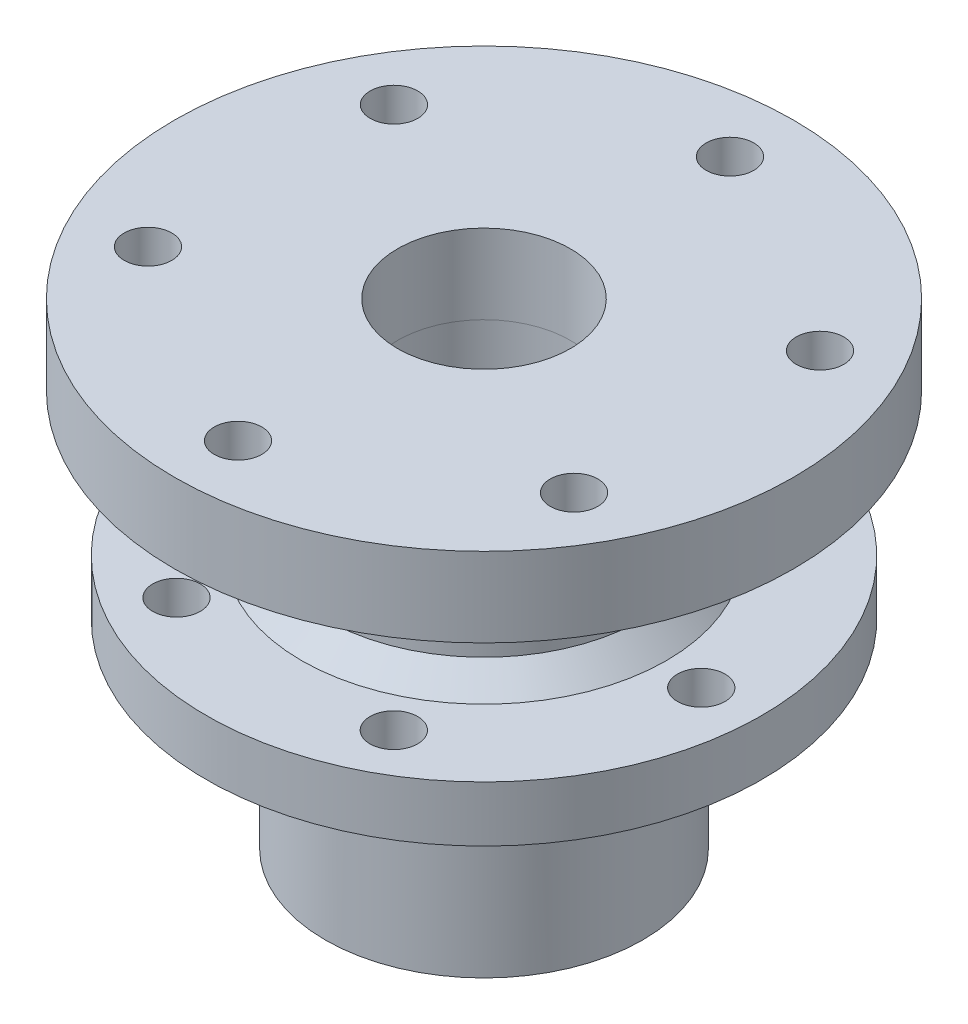
ISO-10303-21;
HEADER;
FILE_DESCRIPTION(('STEP AP214'),'2;1');
FILE_NAME('part.step','',(''),(''),'','','');
FILE_SCHEMA(('AUTOMOTIVE_DESIGN { 1 0 10303 214 1 1 1 1 }'));
ENDSEC;
DATA;
#1=APPLICATION_CONTEXT('core data for automotive mechanical design processes');
#2=APPLICATION_PROTOCOL_DEFINITION('international standard','automotive_design',2000,#1);
#3=PRODUCT_CONTEXT('',#1,'mechanical');
#4=PRODUCT('Part','Part','',(#3));
#5=PRODUCT_RELATED_PRODUCT_CATEGORY('part','',(#4));
#6=PRODUCT_DEFINITION_FORMATION('','',#4);
#7=PRODUCT_DEFINITION_CONTEXT('part definition',#1,'design');
#8=PRODUCT_DEFINITION('design','',#6,#7);
#9=PRODUCT_DEFINITION_SHAPE('','',#8);
#10=(LENGTH_UNIT() NAMED_UNIT(*) SI_UNIT(.MILLI.,.METRE.));
#11=(NAMED_UNIT(*) PLANE_ANGLE_UNIT() SI_UNIT($,.RADIAN.));
#12=(NAMED_UNIT(*) SI_UNIT($,.STERADIAN.) SOLID_ANGLE_UNIT());
#13=UNCERTAINTY_MEASURE_WITH_UNIT(LENGTH_MEASURE(1.E-05),#10,'distance_accuracy_value','');
#14=(GEOMETRIC_REPRESENTATION_CONTEXT(3) GLOBAL_UNCERTAINTY_ASSIGNED_CONTEXT((#13)) GLOBAL_UNIT_ASSIGNED_CONTEXT((#10,
#11,#12)) REPRESENTATION_CONTEXT('',''));
#15=CARTESIAN_POINT('',(0.,0.,0.));
#16=DIRECTION('',(0.,0.,1.));
#17=DIRECTION('',(1.,0.,0.));
#18=AXIS2_PLACEMENT_3D('',#15,#16,#17);
#19=CARTESIAN_POINT('',(0.,40.,0.));
#20=DIRECTION('',(0.,-1.,0.));
#21=DIRECTION('',(0.,0.,-1.));
#22=AXIS2_PLACEMENT_3D('',#19,#20,#21);
#23=CYLINDRICAL_SURFACE('',#22,20.);
#24=CARTESIAN_POINT('',(0.,25.,0.));
#25=DIRECTION('',(0.,-1.,0.));
#26=DIRECTION('',(0.,0.,-1.));
#27=AXIS2_PLACEMENT_3D('',#24,#25,#26);
#28=CIRCLE('',#27,20.);
#29=CARTESIAN_POINT('',(0.,25.,-20.));
#30=VERTEX_POINT('',#29);
#31=EDGE_CURVE('E10',#30,#30,#28,.F.);
#32=ORIENTED_EDGE('',*,*,#31,.T.);
#33=EDGE_LOOP('',(#32));
#34=FACE_BOUND('',#33,.T.);
#35=CARTESIAN_POINT('',(0.,36.,0.));
#36=DIRECTION('',(0.,1.,0.));
#37=DIRECTION('',(0.,0.,1.));
#38=AXIS2_PLACEMENT_3D('',#35,#36,#37);
#39=CIRCLE('',#38,20.);
#40=CARTESIAN_POINT('',(0.,36.,20.));
#41=VERTEX_POINT('',#40);
#42=EDGE_CURVE('E43',#41,#41,#39,.F.);
#43=ORIENTED_EDGE('',*,*,#42,.T.);
#44=EDGE_LOOP('',(#43));
#45=FACE_BOUND('',#44,.T.);
#46=ADVANCED_FACE('F30',(#34,#45),#23,.T.);
#47=CARTESIAN_POINT('',(0.,-10.,0.));
#48=DIRECTION('',(0.,1.,0.));
#49=DIRECTION('',(0.,0.,1.));
#50=AXIS2_PLACEMENT_3D('',#47,#48,#49);
#51=PLANE('',#50);
#52=CARTESIAN_POINT('',(0.,-10.,0.));
#53=DIRECTION('',(0.,1.,0.));
#54=DIRECTION('',(0.,0.,1.));
#55=AXIS2_PLACEMENT_3D('',#52,#53,#54);
#56=CIRCLE('',#55,20.);
#57=CARTESIAN_POINT('',(0.,-10.,20.));
#58=VERTEX_POINT('',#57);
#59=EDGE_CURVE('E109',#58,#58,#56,.T.);
#60=ORIENTED_EDGE('',*,*,#59,.F.);
#61=EDGE_LOOP('',(#60));
#62=FACE_BOUND('',#61,.T.);
#63=CARTESIAN_POINT('',(0.,-10.,0.));
#64=DIRECTION('',(0.,1.,0.));
#65=DIRECTION('',(0.,0.,1.));
#66=AXIS2_PLACEMENT_3D('',#63,#64,#65);
#67=CIRCLE('',#66,11.);
#68=CARTESIAN_POINT('',(0.,-10.,11.));
#69=VERTEX_POINT('',#68);
#70=EDGE_CURVE('E106',#69,#69,#67,.T.);
#71=ORIENTED_EDGE('',*,*,#70,.T.);
#72=EDGE_LOOP('',(#71));
#73=FACE_BOUND('',#72,.T.);
#74=ADVANCED_FACE('F140',(#62,#73),#51,.F.);
#75=CARTESIAN_POINT('',(0.,15.,0.));
#76=DIRECTION('',(0.,-1.,0.));
#77=DIRECTION('',(0.,0.,-1.));
#78=AXIS2_PLACEMENT_3D('',#75,#76,#77);
#79=CIRCLE('',#78,20.);
#80=CARTESIAN_POINT('',(0.,15.,-20.));
#81=VERTEX_POINT('',#80);
#82=EDGE_CURVE('E88',#81,#81,#79,.T.);
#83=ORIENTED_EDGE('',*,*,#82,.T.);
#84=EDGE_LOOP('',(#83));
#85=FACE_BOUND('',#84,.T.);
#86=ORIENTED_EDGE('',*,*,#59,.T.);
#87=EDGE_LOOP('',(#86));
#88=FACE_BOUND('',#87,.T.);
#89=ADVANCED_FACE('F119',(#85,#88),#23,.T.);
#90=CARTESIAN_POINT('',(0.,40.,0.));
#91=DIRECTION('',(0.,-1.,0.));
#92=DIRECTION('',(0.,0.,-1.));
#93=AXIS2_PLACEMENT_3D('',#90,#91,#92);
#94=CYLINDRICAL_SURFACE('',#93,11.);
#95=CARTESIAN_POINT('',(0.,40.,0.));
#96=DIRECTION('',(0.,1.,0.));
#97=DIRECTION('',(0.,0.,1.));
#98=AXIS2_PLACEMENT_3D('',#95,#96,#97);
#99=CIRCLE('',#98,11.);
#100=CARTESIAN_POINT('',(0.,40.,11.));
#101=VERTEX_POINT('',#100);
#102=EDGE_CURVE('E101',#101,#101,#99,.T.);
#103=ORIENTED_EDGE('',*,*,#102,.T.);
#104=EDGE_LOOP('',(#103));
#105=FACE_BOUND('',#104,.T.);
#106=ORIENTED_EDGE('',*,*,#70,.F.);
#107=EDGE_LOOP('',(#106));
#108=FACE_BOUND('',#107,.T.);
#109=ADVANCED_FACE('F149',(#105,#108),#94,.F.);
#110=CARTESIAN_POINT('',(0.,40.,0.));
#111=DIRECTION('',(0.,1.,0.));
#112=DIRECTION('',(0.,0.,1.));
#113=AXIS2_PLACEMENT_3D('',#110,#111,#112);
#114=PLANE('',#113);
#115=CARTESIAN_POINT('',(-26.8467875173174,40.,-15.4999999999996));
#116=DIRECTION('',(0.,1.,0.));
#117=DIRECTION('',(0.,0.,1.));
#118=AXIS2_PLACEMENT_3D('',#115,#116,#117);
#119=CIRCLE('',#118,3.00000000000099);
#120=CARTESIAN_POINT('',(-26.8467875173174,40.,-12.4999999999986));
#121=VERTEX_POINT('',#120);
#122=EDGE_CURVE('E352',#121,#121,#119,.F.);
#123=ORIENTED_EDGE('',*,*,#122,.F.);
#124=EDGE_LOOP('',(#123));
#125=FACE_BOUND('',#124,.T.);
#126=CARTESIAN_POINT('',(-26.846787517317,40.,15.5000000000004));
#127=DIRECTION('',(0.,1.,0.));
#128=DIRECTION('',(0.,0.,1.));
#129=AXIS2_PLACEMENT_3D('',#126,#127,#128);
#130=CIRCLE('',#129,3.00000000000099);
#131=CARTESIAN_POINT('',(-26.846787517317,40.,18.5000000000014));
#132=VERTEX_POINT('',#131);
#133=EDGE_CURVE('E356',#132,#132,#130,.F.);
#134=ORIENTED_EDGE('',*,*,#133,.F.);
#135=EDGE_LOOP('',(#134));
#136=FACE_BOUND('',#135,.T.);
#137=CARTESIAN_POINT('',(8.54895869423195E-13,40.,31.));
#138=DIRECTION('',(0.,1.,0.));
#139=DIRECTION('',(0.,0.,1.));
#140=AXIS2_PLACEMENT_3D('',#137,#138,#139);
#141=CIRCLE('',#140,3.00000000000101);
#142=CARTESIAN_POINT('',(8.54895869423195E-13,40.,34.000000000001));
#143=VERTEX_POINT('',#142);
#144=EDGE_CURVE('E363',#143,#143,#141,.F.);
#145=ORIENTED_EDGE('',*,*,#144,.F.);
#146=EDGE_LOOP('',(#145));
#147=FACE_BOUND('',#146,.T.);
#148=CARTESIAN_POINT('',(26.8467875173182,40.,15.4999999999996));
#149=DIRECTION('',(0.,1.,0.));
#150=DIRECTION('',(0.,0.,1.));
#151=AXIS2_PLACEMENT_3D('',#148,#149,#150);
#152=CIRCLE('',#151,3.00000000000099);
#153=CARTESIAN_POINT('',(26.8467875173182,40.,18.5000000000006));
#154=VERTEX_POINT('',#153);
#155=EDGE_CURVE('E369',#154,#154,#152,.F.);
#156=ORIENTED_EDGE('',*,*,#155,.F.);
#157=EDGE_LOOP('',(#156));
#158=FACE_BOUND('',#157,.T.);
#159=CARTESIAN_POINT('',(26.8467875173178,40.,-15.5000000000004));
#160=DIRECTION('',(0.,1.,0.));
#161=DIRECTION('',(0.,0.,1.));
#162=AXIS2_PLACEMENT_3D('',#159,#160,#161);
#163=CIRCLE('',#162,3.00000000000099);
#164=CARTESIAN_POINT('',(26.8467875173178,40.,-12.4999999999994));
#165=VERTEX_POINT('',#164);
#166=EDGE_CURVE('E375',#165,#165,#163,.F.);
#167=ORIENTED_EDGE('',*,*,#166,.F.);
#168=EDGE_LOOP('',(#167));
#169=FACE_BOUND('',#168,.T.);
#170=CARTESIAN_POINT('',(0.,40.,-31.));
#171=DIRECTION('',(0.,1.,0.));
#172=DIRECTION('',(0.,0.,1.));
#173=AXIS2_PLACEMENT_3D('',#170,#171,#172);
#174=CIRCLE('',#173,3.000000000001);
#175=CARTESIAN_POINT('',(0.,40.,-27.999999999999));
#176=VERTEX_POINT('',#175);
#177=EDGE_CURVE('E381',#176,#176,#174,.F.);
#178=ORIENTED_EDGE('',*,*,#177,.F.);
#179=EDGE_LOOP('',(#178));
#180=FACE_BOUND('',#179,.T.);
#181=CARTESIAN_POINT('',(0.,40.,0.));
#182=DIRECTION('',(0.,1.,0.));
#183=DIRECTION('',(0.,0.,1.));
#184=AXIS2_PLACEMENT_3D('',#181,#182,#183);
#185=CIRCLE('',#184,24.);
#186=CARTESIAN_POINT('',(0.,40.,24.));
#187=VERTEX_POINT('',#186);
#188=EDGE_CURVE('E112',#187,#187,#185,.T.);
#189=ORIENTED_EDGE('',*,*,#188,.T.);
#190=EDGE_LOOP('',(#189));
#191=FACE_BOUND('',#190,.T.);
#192=CARTESIAN_POINT('',(0.,40.,0.));
#193=DIRECTION('',(0.,1.,0.));
#194=DIRECTION('',(0.,0.,1.));
#195=AXIS2_PLACEMENT_3D('',#192,#193,#194);
#196=CIRCLE('',#195,39.);
#197=CARTESIAN_POINT('',(0.,40.,39.));
#198=VERTEX_POINT('',#197);
#199=EDGE_CURVE('E94',#198,#198,#196,.T.);
#200=ORIENTED_EDGE('',*,*,#199,.F.);
#201=EDGE_LOOP('',(#200));
#202=FACE_BOUND('',#201,.T.);
#203=ADVANCED_FACE('F153',(#125,#136,#147,#158,#169,#180,#191,#202),#114,.F.);
#204=CARTESIAN_POINT('',(0.,50.,0.));
#205=DIRECTION('',(0.,1.,0.));
#206=DIRECTION('',(0.,0.,1.));
#207=AXIS2_PLACEMENT_3D('',#204,#205,#206);
#208=PLANE('',#207);
#209=CARTESIAN_POINT('',(-26.8467875173174,50.,-15.4999999999996));
#210=DIRECTION('',(0.,1.,0.));
#211=DIRECTION('',(0.,0.,1.));
#212=AXIS2_PLACEMENT_3D('',#209,#210,#211);
#213=CIRCLE('',#212,3.00000000000099);
#214=CARTESIAN_POINT('',(-26.8467875173174,50.,-12.4999999999986));
#215=VERTEX_POINT('',#214);
#216=EDGE_CURVE('E349',#215,#215,#213,.T.);
#217=ORIENTED_EDGE('',*,*,#216,.F.);
#218=EDGE_LOOP('',(#217));
#219=FACE_BOUND('',#218,.T.);
#220=CARTESIAN_POINT('',(-26.846787517317,50.,15.5000000000004));
#221=DIRECTION('',(0.,1.,0.));
#222=DIRECTION('',(0.,0.,1.));
#223=AXIS2_PLACEMENT_3D('',#220,#221,#222);
#224=CIRCLE('',#223,3.00000000000099);
#225=CARTESIAN_POINT('',(-26.846787517317,50.,18.5000000000014));
#226=VERTEX_POINT('',#225);
#227=EDGE_CURVE('E353',#226,#226,#224,.T.);
#228=ORIENTED_EDGE('',*,*,#227,.F.);
#229=EDGE_LOOP('',(#228));
#230=FACE_BOUND('',#229,.T.);
#231=CARTESIAN_POINT('',(8.54895869423195E-13,50.,31.));
#232=DIRECTION('',(0.,1.,0.));
#233=DIRECTION('',(0.,0.,1.));
#234=AXIS2_PLACEMENT_3D('',#231,#232,#233);
#235=CIRCLE('',#234,3.00000000000101);
#236=CARTESIAN_POINT('',(8.54895869423195E-13,50.,34.000000000001));
#237=VERTEX_POINT('',#236);
#238=EDGE_CURVE('E361',#237,#237,#235,.T.);
#239=ORIENTED_EDGE('',*,*,#238,.F.);
#240=EDGE_LOOP('',(#239));
#241=FACE_BOUND('',#240,.T.);
#242=CARTESIAN_POINT('',(26.8467875173182,50.,15.4999999999996));
#243=DIRECTION('',(0.,1.,0.));
#244=DIRECTION('',(0.,0.,1.));
#245=AXIS2_PLACEMENT_3D('',#242,#243,#244);
#246=CIRCLE('',#245,3.00000000000099);
#247=CARTESIAN_POINT('',(26.8467875173182,50.,18.5000000000006));
#248=VERTEX_POINT('',#247);
#249=EDGE_CURVE('E366',#248,#248,#246,.T.);
#250=ORIENTED_EDGE('',*,*,#249,.F.);
#251=EDGE_LOOP('',(#250));
#252=FACE_BOUND('',#251,.T.);
#253=CARTESIAN_POINT('',(26.8467875173178,50.,-15.5000000000004));
#254=DIRECTION('',(0.,1.,0.));
#255=DIRECTION('',(0.,0.,1.));
#256=AXIS2_PLACEMENT_3D('',#253,#254,#255);
#257=CIRCLE('',#256,3.00000000000099);
#258=CARTESIAN_POINT('',(26.8467875173178,50.,-12.4999999999994));
#259=VERTEX_POINT('',#258);
#260=EDGE_CURVE('E372',#259,#259,#257,.T.);
#261=ORIENTED_EDGE('',*,*,#260,.F.);
#262=EDGE_LOOP('',(#261));
#263=FACE_BOUND('',#262,.T.);
#264=CARTESIAN_POINT('',(0.,50.,-31.));
#265=DIRECTION('',(0.,1.,0.));
#266=DIRECTION('',(0.,0.,1.));
#267=AXIS2_PLACEMENT_3D('',#264,#265,#266);
#268=CIRCLE('',#267,3.000000000001);
#269=CARTESIAN_POINT('',(0.,50.,-27.999999999999));
#270=VERTEX_POINT('',#269);
#271=EDGE_CURVE('E378',#270,#270,#268,.T.);
#272=ORIENTED_EDGE('',*,*,#271,.F.);
#273=EDGE_LOOP('',(#272));
#274=FACE_BOUND('',#273,.T.);
#275=CARTESIAN_POINT('',(0.,50.,0.));
#276=DIRECTION('',(0.,1.,0.));
#277=DIRECTION('',(0.,0.,1.));
#278=AXIS2_PLACEMENT_3D('',#275,#276,#277);
#279=CIRCLE('',#278,39.);
#280=CARTESIAN_POINT('',(0.,50.,39.));
#281=VERTEX_POINT('',#280);
#282=EDGE_CURVE('E98',#281,#281,#279,.T.);
#283=ORIENTED_EDGE('',*,*,#282,.T.);
#284=EDGE_LOOP('',(#283));
#285=FACE_BOUND('',#284,.T.);
#286=CARTESIAN_POINT('',(0.,50.,0.));
#287=DIRECTION('',(0.,1.,0.));
#288=DIRECTION('',(0.,0.,1.));
#289=AXIS2_PLACEMENT_3D('',#286,#287,#288);
#290=CIRCLE('',#289,10.9);
#291=CARTESIAN_POINT('',(0.,50.,10.9));
#292=VERTEX_POINT('',#291);
#293=EDGE_CURVE('E91',#292,#292,#290,.T.);
#294=ORIENTED_EDGE('',*,*,#293,.F.);
#295=EDGE_LOOP('',(#294));
#296=FACE_BOUND('',#295,.T.);
#297=ADVANCED_FACE('F159',(#219,#230,#241,#252,#263,#274,#285,#296),#208,.T.);
#298=ORIENTED_EDGE('',*,*,#102,.F.);
#299=EDGE_LOOP('',(#298));
#300=FACE_BOUND('',#299,.T.);
#301=CARTESIAN_POINT('',(0.,40.,0.));
#302=DIRECTION('',(0.,1.,0.));
#303=DIRECTION('',(0.,0.,1.));
#304=AXIS2_PLACEMENT_3D('',#301,#302,#303);
#305=CIRCLE('',#304,10.9);
#306=CARTESIAN_POINT('',(0.,40.,10.9));
#307=VERTEX_POINT('',#306);
#308=EDGE_CURVE('E95',#307,#307,#305,.T.);
#309=ORIENTED_EDGE('',*,*,#308,.T.);
#310=EDGE_LOOP('',(#309));
#311=FACE_BOUND('',#310,.T.);
#312=ADVANCED_FACE('F162',(#300,#311),#114,.F.);
#313=CARTESIAN_POINT('',(0.,50.,0.));
#314=DIRECTION('',(0.,-1.,0.));
#315=DIRECTION('',(0.,0.,-1.));
#316=AXIS2_PLACEMENT_3D('',#313,#314,#315);
#317=CYLINDRICAL_SURFACE('',#316,39.);
#318=ORIENTED_EDGE('',*,*,#282,.F.);
#319=EDGE_LOOP('',(#318));
#320=FACE_BOUND('',#319,.T.);
#321=ORIENTED_EDGE('',*,*,#199,.T.);
#322=EDGE_LOOP('',(#321));
#323=FACE_BOUND('',#322,.T.);
#324=ADVANCED_FACE('F165',(#320,#323),#317,.T.);
#325=CARTESIAN_POINT('',(0.,50.,0.));
#326=DIRECTION('',(0.,-1.,0.));
#327=DIRECTION('',(0.,0.,-1.));
#328=AXIS2_PLACEMENT_3D('',#325,#326,#327);
#329=CYLINDRICAL_SURFACE('',#328,10.9);
#330=ORIENTED_EDGE('',*,*,#293,.T.);
#331=EDGE_LOOP('',(#330));
#332=FACE_BOUND('',#331,.T.);
#333=ORIENTED_EDGE('',*,*,#308,.F.);
#334=EDGE_LOOP('',(#333));
#335=FACE_BOUND('',#334,.T.);
#336=ADVANCED_FACE('F167',(#332,#335),#329,.F.);
#337=CARTESIAN_POINT('',(0.,40.,0.));
#338=DIRECTION('',(0.,1.,0.));
#339=DIRECTION('',(0.,0.,1.));
#340=AXIS2_PLACEMENT_3D('',#337,#338,#339);
#341=CONICAL_SURFACE('',#340,24.,0.785398163397453);
#342=ORIENTED_EDGE('',*,*,#42,.F.);
#343=EDGE_LOOP('',(#342));
#344=FACE_BOUND('',#343,.T.);
#345=ORIENTED_EDGE('',*,*,#188,.F.);
#346=EDGE_LOOP('',(#345));
#347=FACE_BOUND('',#346,.T.);
#348=ADVANCED_FACE('F134',(#344,#347),#341,.T.);
#349=CARTESIAN_POINT('',(0.,22.,0.));
#350=DIRECTION('',(0.,-1.,0.));
#351=DIRECTION('',(0.,0.,-1.));
#352=AXIS2_PLACEMENT_3D('',#349,#350,#351);
#353=PLANE('',#352);
#354=CARTESIAN_POINT('',(-28.1566501942236,22.,-0.757994041463965));
#355=DIRECTION('',(0.,1.,0.));
#356=DIRECTION('',(0.,0.,1.));
#357=AXIS2_PLACEMENT_3D('',#354,#355,#356);
#358=CIRCLE('',#357,3.00000000863262);
#359=CARTESIAN_POINT('',(-28.1566501942236,22.,2.24200596716866));
#360=VERTEX_POINT('',#359);
#361=EDGE_CURVE('E75',#360,#360,#358,.T.);
#362=ORIENTED_EDGE('',*,*,#361,.F.);
#363=EDGE_LOOP('',(#362));
#364=FACE_BOUND('',#363,.T.);
#365=CARTESIAN_POINT('',(-14.743145251172,22.,24.0099146205686));
#366=DIRECTION('',(0.,1.,0.));
#367=DIRECTION('',(0.,0.,1.));
#368=AXIS2_PLACEMENT_3D('',#365,#366,#367);
#369=CIRCLE('',#368,3.00000000863262);
#370=CARTESIAN_POINT('',(-14.743145251172,22.,27.0099146292012));
#371=VERTEX_POINT('',#370);
#372=EDGE_CURVE('E65',#371,#371,#369,.T.);
#373=ORIENTED_EDGE('',*,*,#372,.F.);
#374=EDGE_LOOP('',(#373));
#375=FACE_BOUND('',#374,.T.);
#376=CARTESIAN_POINT('',(13.4132453202867,22.,24.7774329171141));
#377=DIRECTION('',(0.,1.,0.));
#378=DIRECTION('',(0.,0.,1.));
#379=AXIS2_PLACEMENT_3D('',#376,#377,#378);
#380=CIRCLE('',#379,3.00000000863262);
#381=CARTESIAN_POINT('',(13.4132453202867,22.,27.7774329257467));
#382=VERTEX_POINT('',#381);
#383=EDGE_CURVE('E62',#382,#382,#380,.T.);
#384=ORIENTED_EDGE('',*,*,#383,.F.);
#385=EDGE_LOOP('',(#384));
#386=FACE_BOUND('',#385,.T.);
#387=CARTESIAN_POINT('',(28.1561309486938,22.,0.777042551626911));
#388=DIRECTION('',(0.,1.,0.));
#389=DIRECTION('',(0.,0.,1.));
#390=AXIS2_PLACEMENT_3D('',#387,#388,#389);
#391=CIRCLE('',#390,3.00000000863262);
#392=CARTESIAN_POINT('',(28.1561309486938,22.,3.77704256025953));
#393=VERTEX_POINT('',#392);
#394=EDGE_CURVE('E59',#393,#393,#391,.T.);
#395=ORIENTED_EDGE('',*,*,#394,.F.);
#396=EDGE_LOOP('',(#395));
#397=FACE_BOUND('',#396,.T.);
#398=CARTESIAN_POINT('',(14.7426260056421,22.,-23.9908661104057));
#399=DIRECTION('',(0.,1.,0.));
#400=DIRECTION('',(0.,0.,1.));
#401=AXIS2_PLACEMENT_3D('',#398,#399,#400);
#402=CIRCLE('',#401,3.00000000863296);
#403=CARTESIAN_POINT('',(14.7426260056421,22.,-20.9908661017727));
#404=VERTEX_POINT('',#403);
#405=EDGE_CURVE('E55',#404,#404,#402,.T.);
#406=ORIENTED_EDGE('',*,*,#405,.F.);
#407=EDGE_LOOP('',(#406));
#408=FACE_BOUND('',#407,.T.);
#409=CARTESIAN_POINT('',(-13.4137645658166,22.,-24.7583844069511));
#410=DIRECTION('',(0.,1.,0.));
#411=DIRECTION('',(0.,0.,1.));
#412=AXIS2_PLACEMENT_3D('',#409,#410,#411);
#413=CIRCLE('',#412,3.00000000863262);
#414=CARTESIAN_POINT('',(-13.4137645658166,22.,-21.7583843983185));
#415=VERTEX_POINT('',#414);
#416=EDGE_CURVE('E51',#415,#415,#413,.T.);
#417=ORIENTED_EDGE('',*,*,#416,.F.);
#418=EDGE_LOOP('',(#417));
#419=FACE_BOUND('',#418,.T.);
#420=CARTESIAN_POINT('',(0.,22.,0.));
#421=DIRECTION('',(0.,-1.,0.));
#422=DIRECTION('',(0.,0.,-1.));
#423=AXIS2_PLACEMENT_3D('',#420,#421,#422);
#424=CIRCLE('',#423,23.);
#425=CARTESIAN_POINT('',(0.,22.,-23.));
#426=VERTEX_POINT('',#425);
#427=EDGE_CURVE('E38',#426,#426,#424,.T.);
#428=ORIENTED_EDGE('',*,*,#427,.T.);
#429=EDGE_LOOP('',(#428));
#430=FACE_BOUND('',#429,.T.);
#431=CARTESIAN_POINT('',(0.,22.,0.));
#432=DIRECTION('',(0.,-1.,0.));
#433=DIRECTION('',(0.,0.,-1.));
#434=AXIS2_PLACEMENT_3D('',#431,#432,#433);
#435=CIRCLE('',#434,35.);
#436=CARTESIAN_POINT('',(0.,22.,-35.));
#437=VERTEX_POINT('',#436);
#438=EDGE_CURVE('E85',#437,#437,#435,.T.);
#439=ORIENTED_EDGE('',*,*,#438,.F.);
#440=EDGE_LOOP('',(#439));
#441=FACE_BOUND('',#440,.T.);
#442=ADVANCED_FACE('F125',(#364,#375,#386,#397,#408,#419,#430,#441),#353,.F.);
#443=CARTESIAN_POINT('',(0.,15.,0.));
#444=DIRECTION('',(0.,-1.,0.));
#445=DIRECTION('',(0.,0.,-1.));
#446=AXIS2_PLACEMENT_3D('',#443,#444,#445);
#447=PLANE('',#446);
#448=CARTESIAN_POINT('',(-28.1566501942236,15.,-0.757994041463965));
#449=DIRECTION('',(0.,-1.,0.));
#450=DIRECTION('',(0.,0.,-1.));
#451=AXIS2_PLACEMENT_3D('',#448,#449,#450);
#452=CIRCLE('',#451,3.00000000863262);
#453=CARTESIAN_POINT('',(-28.1566501942236,15.,-3.75799405009659));
#454=VERTEX_POINT('',#453);
#455=EDGE_CURVE('E34',#454,#454,#452,.T.);
#456=ORIENTED_EDGE('',*,*,#455,.F.);
#457=EDGE_LOOP('',(#456));
#458=FACE_BOUND('',#457,.T.);
#459=CARTESIAN_POINT('',(-14.743145251172,15.,24.0099146205686));
#460=DIRECTION('',(0.,-1.,0.));
#461=DIRECTION('',(0.,0.,-1.));
#462=AXIS2_PLACEMENT_3D('',#459,#460,#461);
#463=CIRCLE('',#462,3.00000000863262);
#464=CARTESIAN_POINT('',(-14.743145251172,15.,21.009914611936));
#465=VERTEX_POINT('',#464);
#466=EDGE_CURVE('E63',#465,#465,#463,.T.);
#467=ORIENTED_EDGE('',*,*,#466,.F.);
#468=EDGE_LOOP('',(#467));
#469=FACE_BOUND('',#468,.T.);
#470=CARTESIAN_POINT('',(13.4132453202867,15.,24.7774329171141));
#471=DIRECTION('',(0.,-1.,0.));
#472=DIRECTION('',(0.,0.,-1.));
#473=AXIS2_PLACEMENT_3D('',#470,#471,#472);
#474=CIRCLE('',#473,3.00000000863262);
#475=CARTESIAN_POINT('',(13.4132453202867,15.,21.7774329084814));
#476=VERTEX_POINT('',#475);
#477=EDGE_CURVE('E60',#476,#476,#474,.T.);
#478=ORIENTED_EDGE('',*,*,#477,.F.);
#479=EDGE_LOOP('',(#478));
#480=FACE_BOUND('',#479,.T.);
#481=CARTESIAN_POINT('',(28.1561309486938,15.,0.777042551626911));
#482=DIRECTION('',(0.,-1.,0.));
#483=DIRECTION('',(0.,0.,-1.));
#484=AXIS2_PLACEMENT_3D('',#481,#482,#483);
#485=CIRCLE('',#484,3.00000000863262);
#486=CARTESIAN_POINT('',(28.1561309486938,15.,-2.22295745700571));
#487=VERTEX_POINT('',#486);
#488=EDGE_CURVE('E56',#487,#487,#485,.T.);
#489=ORIENTED_EDGE('',*,*,#488,.F.);
#490=EDGE_LOOP('',(#489));
#491=FACE_BOUND('',#490,.T.);
#492=CARTESIAN_POINT('',(14.7426260056421,15.,-23.9908661104057));
#493=DIRECTION('',(0.,-1.,0.));
#494=DIRECTION('',(0.,0.,-1.));
#495=AXIS2_PLACEMENT_3D('',#492,#493,#494);
#496=CIRCLE('',#495,3.00000000863296);
#497=CARTESIAN_POINT('',(14.7426260056421,15.,-26.9908661190386));
#498=VERTEX_POINT('',#497);
#499=EDGE_CURVE('E52',#498,#498,#496,.T.);
#500=ORIENTED_EDGE('',*,*,#499,.F.);
#501=EDGE_LOOP('',(#500));
#502=FACE_BOUND('',#501,.T.);
#503=CARTESIAN_POINT('',(-13.4137645658166,15.,-24.7583844069511));
#504=DIRECTION('',(0.,-1.,0.));
#505=DIRECTION('',(0.,0.,-1.));
#506=AXIS2_PLACEMENT_3D('',#503,#504,#505);
#507=CIRCLE('',#506,3.00000000863262);
#508=CARTESIAN_POINT('',(-13.4137645658166,15.,-27.7583844155838));
#509=VERTEX_POINT('',#508);
#510=EDGE_CURVE('E47',#509,#509,#507,.T.);
#511=ORIENTED_EDGE('',*,*,#510,.F.);
#512=EDGE_LOOP('',(#511));
#513=FACE_BOUND('',#512,.T.);
#514=CARTESIAN_POINT('',(0.,15.,0.));
#515=DIRECTION('',(0.,-1.,0.));
#516=DIRECTION('',(0.,0.,-1.));
#517=AXIS2_PLACEMENT_3D('',#514,#515,#516);
#518=CIRCLE('',#517,35.);
#519=CARTESIAN_POINT('',(0.,15.,-35.));
#520=VERTEX_POINT('',#519);
#521=EDGE_CURVE('E50',#520,#520,#518,.T.);
#522=ORIENTED_EDGE('',*,*,#521,.T.);
#523=EDGE_LOOP('',(#522));
#524=FACE_BOUND('',#523,.T.);
#525=ORIENTED_EDGE('',*,*,#82,.F.);
#526=EDGE_LOOP('',(#525));
#527=FACE_BOUND('',#526,.T.);
#528=ADVANCED_FACE('F122',(#458,#469,#480,#491,#502,#513,#524,#527),#447,.T.);
#529=CARTESIAN_POINT('',(0.,22.,0.));
#530=DIRECTION('',(0.,-1.,0.));
#531=DIRECTION('',(0.,0.,-1.));
#532=AXIS2_PLACEMENT_3D('',#529,#530,#531);
#533=CYLINDRICAL_SURFACE('',#532,35.);
#534=ORIENTED_EDGE('',*,*,#438,.T.);
#535=EDGE_LOOP('',(#534));
#536=FACE_BOUND('',#535,.T.);
#537=ORIENTED_EDGE('',*,*,#521,.F.);
#538=EDGE_LOOP('',(#537));
#539=FACE_BOUND('',#538,.T.);
#540=ADVANCED_FACE('F124',(#536,#539),#533,.T.);
#541=CARTESIAN_POINT('',(0.,22.,0.));
#542=DIRECTION('',(0.,-1.,0.));
#543=DIRECTION('',(0.,0.,-1.));
#544=AXIS2_PLACEMENT_3D('',#541,#542,#543);
#545=CONICAL_SURFACE('',#544,23.,0.785398163397455);
#546=ORIENTED_EDGE('',*,*,#31,.F.);
#547=EDGE_LOOP('',(#546));
#548=FACE_BOUND('',#547,.T.);
#549=ORIENTED_EDGE('',*,*,#427,.F.);
#550=EDGE_LOOP('',(#549));
#551=FACE_BOUND('',#550,.T.);
#552=ADVANCED_FACE('F32',(#548,#551),#545,.T.);
#553=CARTESIAN_POINT('',(-13.4137645658166,-10.,-24.7583844069511));
#554=DIRECTION('',(0.,1.,0.));
#555=DIRECTION('',(0.,0.,1.));
#556=AXIS2_PLACEMENT_3D('',#553,#554,#555);
#557=CYLINDRICAL_SURFACE('',#556,3.00000000863262);
#558=ORIENTED_EDGE('',*,*,#510,.T.);
#559=EDGE_LOOP('',(#558));
#560=FACE_BOUND('',#559,.T.);
#561=ORIENTED_EDGE('',*,*,#416,.T.);
#562=EDGE_LOOP('',(#561));
#563=FACE_BOUND('',#562,.T.);
#564=ADVANCED_FACE('F214',(#560,#563),#557,.F.);
#565=CARTESIAN_POINT('',(14.7426260056421,-10.,-23.9908661104057));
#566=DIRECTION('',(0.,1.,0.));
#567=DIRECTION('',(0.,0.,1.));
#568=AXIS2_PLACEMENT_3D('',#565,#566,#567);
#569=CYLINDRICAL_SURFACE('',#568,3.00000000863296);
#570=ORIENTED_EDGE('',*,*,#499,.T.);
#571=EDGE_LOOP('',(#570));
#572=FACE_BOUND('',#571,.T.);
#573=ORIENTED_EDGE('',*,*,#405,.T.);
#574=EDGE_LOOP('',(#573));
#575=FACE_BOUND('',#574,.T.);
#576=ADVANCED_FACE('F219',(#572,#575),#569,.F.);
#577=CARTESIAN_POINT('',(28.1561309486938,-10.,0.777042551626911));
#578=DIRECTION('',(0.,1.,0.));
#579=DIRECTION('',(0.,0.,1.));
#580=AXIS2_PLACEMENT_3D('',#577,#578,#579);
#581=CYLINDRICAL_SURFACE('',#580,3.00000000863262);
#582=ORIENTED_EDGE('',*,*,#488,.T.);
#583=EDGE_LOOP('',(#582));
#584=FACE_BOUND('',#583,.T.);
#585=ORIENTED_EDGE('',*,*,#394,.T.);
#586=EDGE_LOOP('',(#585));
#587=FACE_BOUND('',#586,.T.);
#588=ADVANCED_FACE('F229',(#584,#587),#581,.F.);
#589=CARTESIAN_POINT('',(13.4132453202867,-10.,24.7774329171141));
#590=DIRECTION('',(0.,1.,0.));
#591=DIRECTION('',(0.,0.,1.));
#592=AXIS2_PLACEMENT_3D('',#589,#590,#591);
#593=CYLINDRICAL_SURFACE('',#592,3.00000000863262);
#594=ORIENTED_EDGE('',*,*,#477,.T.);
#595=EDGE_LOOP('',(#594));
#596=FACE_BOUND('',#595,.T.);
#597=ORIENTED_EDGE('',*,*,#383,.T.);
#598=EDGE_LOOP('',(#597));
#599=FACE_BOUND('',#598,.T.);
#600=ADVANCED_FACE('F239',(#596,#599),#593,.F.);
#601=CARTESIAN_POINT('',(-14.743145251172,-10.,24.0099146205686));
#602=DIRECTION('',(0.,1.,0.));
#603=DIRECTION('',(0.,0.,1.));
#604=AXIS2_PLACEMENT_3D('',#601,#602,#603);
#605=CYLINDRICAL_SURFACE('',#604,3.00000000863262);
#606=ORIENTED_EDGE('',*,*,#466,.T.);
#607=EDGE_LOOP('',(#606));
#608=FACE_BOUND('',#607,.T.);
#609=ORIENTED_EDGE('',*,*,#372,.T.);
#610=EDGE_LOOP('',(#609));
#611=FACE_BOUND('',#610,.T.);
#612=ADVANCED_FACE('F249',(#608,#611),#605,.F.);
#613=CARTESIAN_POINT('',(-28.1566501942236,-10.,-0.757994041463965));
#614=DIRECTION('',(0.,1.,0.));
#615=DIRECTION('',(0.,0.,1.));
#616=AXIS2_PLACEMENT_3D('',#613,#614,#615);
#617=CYLINDRICAL_SURFACE('',#616,3.00000000863262);
#618=ORIENTED_EDGE('',*,*,#455,.T.);
#619=EDGE_LOOP('',(#618));
#620=FACE_BOUND('',#619,.T.);
#621=ORIENTED_EDGE('',*,*,#361,.T.);
#622=EDGE_LOOP('',(#621));
#623=FACE_BOUND('',#622,.T.);
#624=ADVANCED_FACE('F259',(#620,#623),#617,.F.);
#625=CARTESIAN_POINT('',(0.,-10.001,-31.));
#626=DIRECTION('',(0.,1.,0.));
#627=DIRECTION('',(0.,0.,1.));
#628=AXIS2_PLACEMENT_3D('',#625,#626,#627);
#629=CYLINDRICAL_SURFACE('',#628,3.000000000001);
#630=ORIENTED_EDGE('',*,*,#271,.T.);
#631=EDGE_LOOP('',(#630));
#632=FACE_BOUND('',#631,.T.);
#633=ORIENTED_EDGE('',*,*,#177,.T.);
#634=EDGE_LOOP('',(#633));
#635=FACE_BOUND('',#634,.T.);
#636=ADVANCED_FACE('F268',(#632,#635),#629,.F.);
#637=CARTESIAN_POINT('',(26.8467875173178,-10.001,-15.5000000000004));
#638=DIRECTION('',(0.,1.,0.));
#639=DIRECTION('',(0.,0.,1.));
#640=AXIS2_PLACEMENT_3D('',#637,#638,#639);
#641=CYLINDRICAL_SURFACE('',#640,3.00000000000099);
#642=ORIENTED_EDGE('',*,*,#260,.T.);
#643=EDGE_LOOP('',(#642));
#644=FACE_BOUND('',#643,.T.);
#645=ORIENTED_EDGE('',*,*,#166,.T.);
#646=EDGE_LOOP('',(#645));
#647=FACE_BOUND('',#646,.T.);
#648=ADVANCED_FACE('F292',(#644,#647),#641,.F.);
#649=CARTESIAN_POINT('',(26.8467875173182,-10.001,15.4999999999996));
#650=DIRECTION('',(0.,1.,0.));
#651=DIRECTION('',(0.,0.,1.));
#652=AXIS2_PLACEMENT_3D('',#649,#650,#651);
#653=CYLINDRICAL_SURFACE('',#652,3.00000000000099);
#654=ORIENTED_EDGE('',*,*,#249,.T.);
#655=EDGE_LOOP('',(#654));
#656=FACE_BOUND('',#655,.T.);
#657=ORIENTED_EDGE('',*,*,#155,.T.);
#658=EDGE_LOOP('',(#657));
#659=FACE_BOUND('',#658,.T.);
#660=ADVANCED_FACE('F302',(#656,#659),#653,.F.);
#661=CARTESIAN_POINT('',(8.54895869423195E-13,-10.001,31.));
#662=DIRECTION('',(0.,1.,0.));
#663=DIRECTION('',(0.,0.,1.));
#664=AXIS2_PLACEMENT_3D('',#661,#662,#663);
#665=CYLINDRICAL_SURFACE('',#664,3.00000000000101);
#666=ORIENTED_EDGE('',*,*,#238,.T.);
#667=EDGE_LOOP('',(#666));
#668=FACE_BOUND('',#667,.T.);
#669=ORIENTED_EDGE('',*,*,#144,.T.);
#670=EDGE_LOOP('',(#669));
#671=FACE_BOUND('',#670,.T.);
#672=ADVANCED_FACE('F312',(#668,#671),#665,.F.);
#673=CARTESIAN_POINT('',(-26.846787517317,-10.001,15.5000000000004));
#674=DIRECTION('',(0.,1.,0.));
#675=DIRECTION('',(0.,0.,1.));
#676=AXIS2_PLACEMENT_3D('',#673,#674,#675);
#677=CYLINDRICAL_SURFACE('',#676,3.00000000000099);
#678=ORIENTED_EDGE('',*,*,#227,.T.);
#679=EDGE_LOOP('',(#678));
#680=FACE_BOUND('',#679,.T.);
#681=ORIENTED_EDGE('',*,*,#133,.T.);
#682=EDGE_LOOP('',(#681));
#683=FACE_BOUND('',#682,.T.);
#684=ADVANCED_FACE('F322',(#680,#683),#677,.F.);
#685=CARTESIAN_POINT('',(-26.8467875173174,-10.001,-15.4999999999996));
#686=DIRECTION('',(0.,1.,0.));
#687=DIRECTION('',(0.,0.,1.));
#688=AXIS2_PLACEMENT_3D('',#685,#686,#687);
#689=CYLINDRICAL_SURFACE('',#688,3.00000000000099);
#690=ORIENTED_EDGE('',*,*,#216,.T.);
#691=EDGE_LOOP('',(#690));
#692=FACE_BOUND('',#691,.T.);
#693=ORIENTED_EDGE('',*,*,#122,.T.);
#694=EDGE_LOOP('',(#693));
#695=FACE_BOUND('',#694,.T.);
#696=ADVANCED_FACE('F332',(#692,#695),#689,.F.);
#697=CLOSED_SHELL('',(#46,#74,#89,#109,#203,#297,#312,#324,#336,#348,#442,#528,#540,#552,#564,
#576,#588,#600,#612,#624,#636,#648,#660,#672,#684,#696));
#698=MANIFOLD_SOLID_BREP('B2',#697);
#699=ADVANCED_BREP_SHAPE_REPRESENTATION('',(#18,#698),#14);
#700=SHAPE_DEFINITION_REPRESENTATION(#9,#699);
ENDSEC;
END-ISO-10303-21;
